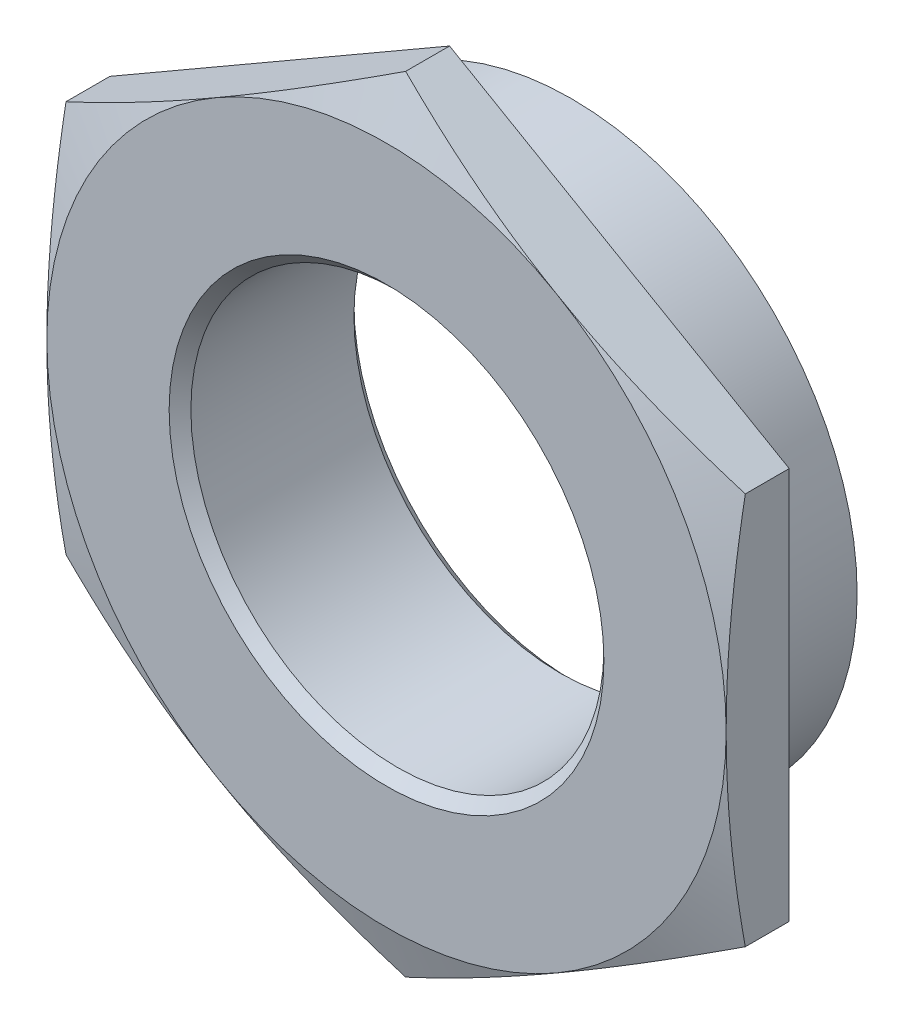
ISO-10303-21;
HEADER;
FILE_DESCRIPTION(('STEP AP214'),'2;1');
FILE_NAME('part.step','',(''),(''),'','','');
FILE_SCHEMA(('AUTOMOTIVE_DESIGN { 1 0 10303 214 1 1 1 1 }'));
ENDSEC;
DATA;
#1=APPLICATION_CONTEXT('core data for automotive mechanical design processes');
#2=APPLICATION_PROTOCOL_DEFINITION('international standard','automotive_design',2000,#1);
#3=PRODUCT_CONTEXT('',#1,'mechanical');
#4=PRODUCT('Part','Part','',(#3));
#5=PRODUCT_RELATED_PRODUCT_CATEGORY('part','',(#4));
#6=PRODUCT_DEFINITION_FORMATION('','',#4);
#7=PRODUCT_DEFINITION_CONTEXT('part definition',#1,'design');
#8=PRODUCT_DEFINITION('design','',#6,#7);
#9=PRODUCT_DEFINITION_SHAPE('','',#8);
#10=(LENGTH_UNIT() NAMED_UNIT(*) SI_UNIT(.MILLI.,.METRE.));
#11=(NAMED_UNIT(*) PLANE_ANGLE_UNIT() SI_UNIT($,.RADIAN.));
#12=(NAMED_UNIT(*) SI_UNIT($,.STERADIAN.) SOLID_ANGLE_UNIT());
#13=UNCERTAINTY_MEASURE_WITH_UNIT(LENGTH_MEASURE(1.E-05),#10,'distance_accuracy_value','');
#14=(GEOMETRIC_REPRESENTATION_CONTEXT(3) GLOBAL_UNCERTAINTY_ASSIGNED_CONTEXT((#13)) GLOBAL_UNIT_ASSIGNED_CONTEXT((#10,
#11,#12)) REPRESENTATION_CONTEXT('',''));
#15=CARTESIAN_POINT('',(0.,0.,0.));
#16=DIRECTION('',(0.,0.,1.));
#17=DIRECTION('',(1.,0.,0.));
#18=AXIS2_PLACEMENT_3D('',#15,#16,#17);
#19=CARTESIAN_POINT('',(3.96875,2.29135888084633,-2.159));
#20=DIRECTION('',(0.5,0.866025403784439,0.));
#21=DIRECTION('',(-0.866025403784439,0.5,0.));
#22=AXIS2_PLACEMENT_3D('',#19,#20,#21);
#23=PLANE('',#22);
#24=DIRECTION('',(0.,0.,1.));
#25=VECTOR('',#24,1.);
#26=CARTESIAN_POINT('',(0.,4.58271776169265,-2.159));
#27=LINE('',#26,#25);
#28=CARTESIAN_POINT('',(0.,4.58271776169265,-0.7366));
#29=VERTEX_POINT('',#28);
#30=CARTESIAN_POINT('',(0.,4.58271776169265,-0.223465990055169));
#31=VERTEX_POINT('',#30);
#32=EDGE_CURVE('E130',#29,#31,#27,.T.);
#33=ORIENTED_EDGE('',*,*,#32,.T.);
#34=CARTESIAN_POINT('',(-0.000200000000000889,4.58283323174649,-0.223508019306122));
#35=CARTESIAN_POINT('',(0.164171124478996,4.48793351878154,-0.188953386893572));
#36=CARTESIAN_POINT('',(0.329084297102321,4.39272085417455,-0.157519889082355));
#37=CARTESIAN_POINT('',(0.659982994631842,4.20167640208138,-0.102217415747108));
#38=CARTESIAN_POINT('',(0.825969255714269,4.10584418956367,-0.0783543603716573));
#39=CARTESIAN_POINT('',(1.15717193911945,3.91462423114336,-0.0397565169298386));
#40=CARTESIAN_POINT('',(1.32238079647206,3.81924085287832,-0.0249375356401638));
#41=CARTESIAN_POINT('',(1.65318488137888,3.62825102540834,-0.00506110758966477));
#42=CARTESIAN_POINT('',(1.81877994068944,3.53264467333892,0.));
#43=CARTESIAN_POINT('',(2.14997005931056,3.34143196920007,0.));
#44=CARTESIAN_POINT('',(2.31556511862112,3.24582561713064,-0.00506110758966457));
#45=CARTESIAN_POINT('',(2.64636920352794,3.05483578966066,-0.0249375356401636));
#46=CARTESIAN_POINT('',(2.81157806088055,2.95945241139562,-0.0397565169298384));
#47=CARTESIAN_POINT('',(3.14278074428573,2.76823245297532,-0.078354360371657));
#48=CARTESIAN_POINT('',(3.30876700536815,2.6724002404576,-0.102217415747107));
#49=CARTESIAN_POINT('',(3.63966570289768,2.48135578836443,-0.157519889082355));
#50=CARTESIAN_POINT('',(3.804578875521,2.38614312375744,-0.188953386893571));
#51=CARTESIAN_POINT('',(3.96895,2.29124341079249,-0.223508019306122));
#52=B_SPLINE_CURVE_WITH_KNOTS('',3,(#34,#35,#36,#37,#38,#39,#40,#41,#42,#43,#44,#45,#46,#47,#48,
#49,#50,#51),.UNSPECIFIED.,.F.,.F.,(4,2,2,2,2,2,2,2,4),(0.,0.578817519156193,1.15808656897075,
1.73187737871073,2.30545287935136,2.879028379992,3.45281918973198,4.03208823954654,
4.61090575870273),.UNSPECIFIED.);
#53=CARTESIAN_POINT('',(1.984375,3.43703832126949,0.));
#54=VERTEX_POINT('',#53);
#55=EDGE_CURVE('E61',#31,#54,#52,.T.);
#56=ORIENTED_EDGE('',*,*,#55,.T.);
#57=CARTESIAN_POINT('',(3.96875,2.29135888084633,-0.223465990055169));
#58=VERTEX_POINT('',#57);
#59=EDGE_CURVE('E108',#54,#58,#52,.T.);
#60=ORIENTED_EDGE('',*,*,#59,.T.);
#61=DIRECTION('',(0.,0.,1.));
#62=VECTOR('',#61,1.);
#63=CARTESIAN_POINT('',(3.96875,2.29135888084633,-2.159));
#64=LINE('',#63,#62);
#65=CARTESIAN_POINT('',(3.96875,2.29135888084633,-0.7366));
#66=VERTEX_POINT('',#65);
#67=EDGE_CURVE('E217',#66,#58,#64,.T.);
#68=ORIENTED_EDGE('',*,*,#67,.F.);
#69=DIRECTION('',(0.866025403784439,-0.5,0.));
#70=VECTOR('',#69,1.);
#71=CARTESIAN_POINT('',(3.96875,2.29135888084633,-0.7366));
#72=LINE('',#71,#70);
#73=EDGE_CURVE('E229',#29,#66,#72,.T.);
#74=ORIENTED_EDGE('',*,*,#73,.F.);
#75=EDGE_LOOP('',(#33,#56,#60,#68,#74));
#76=FACE_BOUND('',#75,.T.);
#77=ADVANCED_FACE('F37',(#76),#23,.T.);
#78=CARTESIAN_POINT('',(3.96875,-2.29135888084633,-2.159));
#79=DIRECTION('',(1.,0.,0.));
#80=DIRECTION('',(0.,1.,0.));
#81=AXIS2_PLACEMENT_3D('',#78,#79,#80);
#82=PLANE('',#81);
#83=ORIENTED_EDGE('',*,*,#67,.T.);
#84=CARTESIAN_POINT('',(3.96875,-6.11571747941205,-1.20905773002469));
#85=CARTESIAN_POINT('',(3.96875,-5.93560694210027,-1.15408226577977));
#86=CARTESIAN_POINT('',(3.96875,-5.7553003299482,-1.09973764457856));
#87=CARTESIAN_POINT('',(3.96875,-5.3941949938018,-0.99265901905197));
#88=CARTESIAN_POINT('',(3.96875,-5.21339623309016,-0.939925138695819));
#89=CARTESIAN_POINT('',(3.96875,-4.85090969844325,-0.83633271936481));
#90=CARTESIAN_POINT('',(3.96875,-4.66922091189536,-0.785477711144874));
#91=CARTESIAN_POINT('',(3.96875,-4.30517416670347,-0.686225484944989));
#92=CARTESIAN_POINT('',(3.96875,-4.12281621981197,-0.637828224018921));
#93=CARTESIAN_POINT('',(3.96875,-3.75955319947585,-0.544676401725705));
#94=CARTESIAN_POINT('',(3.96875,-3.57865776921711,-0.499884418257548));
#95=CARTESIAN_POINT('',(3.96875,-3.21598143545444,-0.414042678868963));
#96=CARTESIAN_POINT('',(3.96875,-3.03420056135954,-0.372992799539532));
#97=CARTESIAN_POINT('',(3.96875,-2.66968893890538,-0.295572325523377));
#98=CARTESIAN_POINT('',(3.96875,-2.48695846562532,-0.259200446620567));
#99=CARTESIAN_POINT('',(3.96875,-2.12043447101567,-0.192231102887664));
#100=CARTESIAN_POINT('',(3.96875,-1.93664098429678,-0.16163345113298));
#101=CARTESIAN_POINT('',(3.96875,-1.58856786823472,-0.110464072059641));
#102=CARTESIAN_POINT('',(3.96875,-1.4243976824194,-0.0891548112543641));
#103=CARTESIAN_POINT('',(3.96875,-1.09535768248127,-0.0529207014050567));
#104=CARTESIAN_POINT('',(3.96875,-0.930487929274615,-0.0379953075457442));
#105=CARTESIAN_POINT('',(3.96875,-0.600370610485894,-0.0152447943074484));
#106=CARTESIAN_POINT('',(3.96875,-0.43512340258056,-0.00741456835886472));
#107=CARTESIAN_POINT('',(3.96875,-0.104442010557871,0.000747429412386027));
#108=CARTESIAN_POINT('',(3.96875,0.0609921719480483,0.00107926537421316));
#109=CARTESIAN_POINT('',(3.96875,0.392556885344696,-0.00579169582896528));
#110=CARTESIAN_POINT('',(3.96875,0.558686595571475,-0.0130334478245484));
#111=CARTESIAN_POINT('',(3.96875,0.890471142111432,-0.0347204552699951));
#112=CARTESIAN_POINT('',(3.96875,1.05612596671929,-0.0491658867716981));
#113=CARTESIAN_POINT('',(3.96875,1.38687577329655,-0.0845743007464572));
#114=CARTESIAN_POINT('',(3.96875,1.55197012931405,-0.10554304561562));
#115=CARTESIAN_POINT('',(3.96875,1.88133239796501,-0.153132898911361));
#116=CARTESIAN_POINT('',(3.96875,2.04560030739566,-0.179754029225919));
#117=CARTESIAN_POINT('',(3.96875,2.3867940635803,-0.240157768471628));
#118=CARTESIAN_POINT('',(3.96875,2.56364678604448,-0.274349885700776));
#119=CARTESIAN_POINT('',(3.96875,2.91641463617557,-0.347298240655703));
#120=CARTESIAN_POINT('',(3.96875,3.0923296841202,-0.386054860190044));
#121=CARTESIAN_POINT('',(3.96875,3.44335289056624,-0.467265016425243));
#122=CARTESIAN_POINT('',(3.96875,3.61846079952144,-0.509719625019478));
#123=CARTESIAN_POINT('',(3.96875,3.96793001185936,-0.597607301830452));
#124=CARTESIAN_POINT('',(3.96875,4.14229128815387,-0.643040477151891));
#125=CARTESIAN_POINT('',(3.96875,4.66489047728162,-0.783043930086198));
#126=CARTESIAN_POINT('',(3.96875,5.01216499463144,-0.881203844915603));
#127=CARTESIAN_POINT('',(3.96875,5.70478701779749,-1.08379959604706));
#128=CARTESIAN_POINT('',(3.96874999999999,6.05013485099281,-1.18823432830457));
#129=CARTESIAN_POINT('',(3.96874999999999,6.73560553195841,-1.40022049685068));
#130=CARTESIAN_POINT('',(3.96874999999999,7.07574339741463,-1.50772353420053));
#131=CARTESIAN_POINT('',(3.96874999999999,7.75507399051602,-1.72572515333206));
#132=CARTESIAN_POINT('',(3.96874999999999,8.09426666712917,-1.83622389352782));
#133=CARTESIAN_POINT('',(3.96874999999999,8.77056405077001,-2.05894124214238));
#134=CARTESIAN_POINT('',(3.96874999999999,9.10767165256316,-2.17115108096458));
#135=CARTESIAN_POINT('',(3.96874999999999,9.78130609176436,-2.39720590735634));
#136=CARTESIAN_POINT('',(3.96874999999999,10.1178329770118,-2.51105075224825));
#137=CARTESIAN_POINT('',(3.96874999999999,10.454163831933,-2.62546352850404));
#138=B_SPLINE_CURVE_WITH_KNOTS('',3,(#84,#85,#86,#87,#88,#89,#90,#91,#92,#93,#94,#95,#96,#97,
#98,#99,#100,#101,#102,#103,#104,#105,#106,#107,#108,#109,#110,#111,#112,#113,#114,#115,#116,
#117,#118,#119,#120,#121,#122,#123,#124,#125,#126,#127,#128,#129,#130,#131,#132,#133,#134,#135,
#136,#137),.UNSPECIFIED.,.F.,.F.,(4,2,2,2,2,2,2,2,2,2,2,2,2,2,2,2,2,2,2,2,2,2,2,2,2,2,4),(0.,
0.56494544827728,1.12993426806961,1.69593576698342,2.26192737230977,2.820971372696,
3.37999692997149,3.93886869312937,4.49772236125909,4.99425676552057,5.49074878582625,
5.98688318393511,6.48301333824554,6.98170795284575,7.48041475571822,7.97956335025277,
8.47871387769757,9.01902204899537,9.55937544778716,10.0998859971276,10.6404159930717,
11.7229520219686,12.8052981349312,13.8754444016963,14.9456473690742,16.011519422179,
17.0772990211503),.UNSPECIFIED.);
#139=CARTESIAN_POINT('',(3.96875,0.,0.));
#140=VERTEX_POINT('',#139);
#141=EDGE_CURVE('E111',#58,#140,#138,.F.);
#142=ORIENTED_EDGE('',*,*,#141,.T.);
#143=CARTESIAN_POINT('',(3.96875,-2.29135888084633,-0.223465990055169));
#144=VERTEX_POINT('',#143);
#145=EDGE_CURVE('E140',#140,#144,#138,.F.);
#146=ORIENTED_EDGE('',*,*,#145,.T.);
#147=DIRECTION('',(0.,0.,1.));
#148=VECTOR('',#147,1.);
#149=CARTESIAN_POINT('',(3.96875,-2.29135888084633,-2.159));
#150=LINE('',#149,#148);
#151=CARTESIAN_POINT('',(3.96875,-2.29135888084633,-0.7366));
#152=VERTEX_POINT('',#151);
#153=EDGE_CURVE('E222',#152,#144,#150,.T.);
#154=ORIENTED_EDGE('',*,*,#153,.F.);
#155=DIRECTION('',(0.,-1.,0.));
#156=VECTOR('',#155,1.);
#157=CARTESIAN_POINT('',(3.96875,-2.29135888084633,-0.7366));
#158=LINE('',#157,#156);
#159=EDGE_CURVE('E220',#66,#152,#158,.T.);
#160=ORIENTED_EDGE('',*,*,#159,.F.);
#161=EDGE_LOOP('',(#83,#142,#146,#154,#160));
#162=FACE_BOUND('',#161,.T.);
#163=ADVANCED_FACE('F188',(#162),#82,.T.);
#164=CARTESIAN_POINT('',(0.,-4.58271776169265,-2.159));
#165=DIRECTION('',(0.5,-0.866025403784439,0.));
#166=DIRECTION('',(0.866025403784439,0.5,0.));
#167=AXIS2_PLACEMENT_3D('',#164,#165,#166);
#168=PLANE('',#167);
#169=ORIENTED_EDGE('',*,*,#153,.T.);
#170=CARTESIAN_POINT('',(3.96895,-2.29124341079249,-0.223508019306122));
#171=CARTESIAN_POINT('',(3.804578875521,-2.38614312375744,-0.188953386893572));
#172=CARTESIAN_POINT('',(3.63966570289768,-2.48135578836443,-0.157519889082355));
#173=CARTESIAN_POINT('',(3.30876700536816,-2.6724002404576,-0.102217415747108));
#174=CARTESIAN_POINT('',(3.14278074428573,-2.76823245297532,-0.0783543603716575));
#175=CARTESIAN_POINT('',(2.81157806088055,-2.95945241139562,-0.0397565169298387));
#176=CARTESIAN_POINT('',(2.64636920352794,-3.05483578966066,-0.0249375356401637));
#177=CARTESIAN_POINT('',(2.31556511862112,-3.24582561713064,-0.00506110758966481));
#178=CARTESIAN_POINT('',(2.14997005931056,-3.34143196920007,0.));
#179=CARTESIAN_POINT('',(1.81877994068944,-3.53264467333892,0.));
#180=CARTESIAN_POINT('',(1.65318488137888,-3.62825102540834,-0.00506110758966487));
#181=CARTESIAN_POINT('',(1.32238079647206,-3.81924085287832,-0.0249375356401637));
#182=CARTESIAN_POINT('',(1.15717193911945,-3.91462423114336,-0.0397565169298384));
#183=CARTESIAN_POINT('',(0.825969255714271,-4.10584418956367,-0.0783543603716572));
#184=CARTESIAN_POINT('',(0.659982994631844,-4.20167640208138,-0.102217415747108));
#185=CARTESIAN_POINT('',(0.329084297102322,-4.39272085417455,-0.157519889082355));
#186=CARTESIAN_POINT('',(0.164171124478998,-4.48793351878154,-0.188953386893572));
#187=CARTESIAN_POINT('',(-0.000199999999998635,-4.58283323174649,-0.223508019306122));
#188=B_SPLINE_CURVE_WITH_KNOTS('',3,(#170,#171,#172,#173,#174,#175,#176,#177,#178,#179,#180,
#181,#182,#183,#184,#185,#186,#187),.UNSPECIFIED.,.F.,.F.,(4,2,2,2,2,2,2,2,4),(0.,
0.578817519156193,1.15808656897075,1.73187737871073,2.30545287935136,2.879028379992,
3.45281918973198,4.03208823954654,4.61090575870273),.UNSPECIFIED.);
#189=CARTESIAN_POINT('',(1.984375,-3.43703832126949,0.));
#190=VERTEX_POINT('',#189);
#191=EDGE_CURVE('E182',#144,#190,#188,.T.);
#192=ORIENTED_EDGE('',*,*,#191,.T.);
#193=CARTESIAN_POINT('',(0.,-4.58271776169265,-0.223465990055169));
#194=VERTEX_POINT('',#193);
#195=EDGE_CURVE('E176',#190,#194,#188,.T.);
#196=ORIENTED_EDGE('',*,*,#195,.T.);
#197=DIRECTION('',(0.,0.,1.));
#198=VECTOR('',#197,1.);
#199=CARTESIAN_POINT('',(0.,-4.58271776169265,-2.159));
#200=LINE('',#199,#198);
#201=CARTESIAN_POINT('',(0.,-4.58271776169265,-0.7366));
#202=VERTEX_POINT('',#201);
#203=EDGE_CURVE('E226',#202,#194,#200,.T.);
#204=ORIENTED_EDGE('',*,*,#203,.F.);
#205=DIRECTION('',(-0.866025403784439,-0.5,0.));
#206=VECTOR('',#205,1.);
#207=CARTESIAN_POINT('',(0.,-4.58271776169265,-0.7366));
#208=LINE('',#207,#206);
#209=EDGE_CURVE('E260',#152,#202,#208,.T.);
#210=ORIENTED_EDGE('',*,*,#209,.F.);
#211=EDGE_LOOP('',(#169,#192,#196,#204,#210));
#212=FACE_BOUND('',#211,.T.);
#213=ADVANCED_FACE('F184',(#212),#168,.T.);
#214=CARTESIAN_POINT('',(-3.96875,-2.29135888084633,-2.159));
#215=DIRECTION('',(-0.5,-0.866025403784439,0.));
#216=DIRECTION('',(0.866025403784439,-0.5,0.));
#217=AXIS2_PLACEMENT_3D('',#214,#215,#216);
#218=PLANE('',#217);
#219=ORIENTED_EDGE('',*,*,#203,.T.);
#220=CARTESIAN_POINT('',(0.000200000000000944,-4.58283323174649,-0.223508019306122));
#221=CARTESIAN_POINT('',(-0.164171124478996,-4.48793351878154,-0.188953386893571));
#222=CARTESIAN_POINT('',(-0.329084297102321,-4.39272085417455,-0.157519889082355));
#223=CARTESIAN_POINT('',(-0.659982994631842,-4.20167640208138,-0.102217415747107));
#224=CARTESIAN_POINT('',(-0.825969255714269,-4.10584418956367,-0.078354360371657));
#225=CARTESIAN_POINT('',(-1.15717193911945,-3.91462423114336,-0.0397565169298382));
#226=CARTESIAN_POINT('',(-1.32238079647206,-3.81924085287832,-0.0249375356401632));
#227=CARTESIAN_POINT('',(-1.65318488137888,-3.62825102540834,-0.00506110758966421));
#228=CARTESIAN_POINT('',(-1.81877994068944,-3.53264467333891,0.));
#229=CARTESIAN_POINT('',(-2.14997005931056,-3.34143196920007,0.));
#230=CARTESIAN_POINT('',(-2.31556511862112,-3.24582561713064,-0.00506110758966442));
#231=CARTESIAN_POINT('',(-2.64636920352794,-3.05483578966066,-0.0249375356401634));
#232=CARTESIAN_POINT('',(-2.81157806088055,-2.95945241139562,-0.0397565169298383));
#233=CARTESIAN_POINT('',(-3.14278074428573,-2.76823245297532,-0.0783543603716571));
#234=CARTESIAN_POINT('',(-3.30876700536816,-2.6724002404576,-0.102217415747108));
#235=CARTESIAN_POINT('',(-3.63966570289768,-2.48135578836443,-0.157519889082355));
#236=CARTESIAN_POINT('',(-3.804578875521,-2.38614312375744,-0.188953386893572));
#237=CARTESIAN_POINT('',(-3.96895,-2.29124341079249,-0.223508019306122));
#238=B_SPLINE_CURVE_WITH_KNOTS('',3,(#220,#221,#222,#223,#224,#225,#226,#227,#228,#229,#230,
#231,#232,#233,#234,#235,#236,#237),.UNSPECIFIED.,.F.,.F.,(4,2,2,2,2,2,2,2,4),(0.,
0.578817519156193,1.15808656897075,1.73187737871073,2.30545287935137,2.879028379992,
3.45281918973198,4.03208823954654,4.61090575870273),.UNSPECIFIED.);
#239=CARTESIAN_POINT('',(-1.984375,-3.43703832126949,0.));
#240=VERTEX_POINT('',#239);
#241=EDGE_CURVE('E183',#194,#240,#238,.T.);
#242=ORIENTED_EDGE('',*,*,#241,.T.);
#243=CARTESIAN_POINT('',(-3.96875,-2.29135888084634,-0.223465990055154));
#244=VERTEX_POINT('',#243);
#245=EDGE_CURVE('E171',#240,#244,#238,.T.);
#246=ORIENTED_EDGE('',*,*,#245,.T.);
#247=DIRECTION('',(0.,0.,1.));
#248=VECTOR('',#247,1.);
#249=CARTESIAN_POINT('',(-3.96875,-2.29135888084633,-2.159));
#250=LINE('',#249,#248);
#251=CARTESIAN_POINT('',(-3.96875,-2.29135888084633,-0.7366));
#252=VERTEX_POINT('',#251);
#253=EDGE_CURVE('E234',#252,#244,#250,.T.);
#254=ORIENTED_EDGE('',*,*,#253,.F.);
#255=DIRECTION('',(-0.866025403784439,0.5,0.));
#256=VECTOR('',#255,1.);
#257=CARTESIAN_POINT('',(-3.96875,-2.29135888084633,-0.7366));
#258=LINE('',#257,#256);
#259=EDGE_CURVE('E258',#202,#252,#258,.T.);
#260=ORIENTED_EDGE('',*,*,#259,.F.);
#261=EDGE_LOOP('',(#219,#242,#246,#254,#260));
#262=FACE_BOUND('',#261,.T.);
#263=ADVANCED_FACE('F187',(#262),#218,.T.);
#264=CARTESIAN_POINT('',(-3.96875,2.29135888084633,-2.159));
#265=DIRECTION('',(-1.,0.,0.));
#266=DIRECTION('',(0.,0.,1.));
#267=AXIS2_PLACEMENT_3D('',#264,#265,#266);
#268=PLANE('',#267);
#269=ORIENTED_EDGE('',*,*,#253,.T.);
#270=CARTESIAN_POINT('',(-3.96875,-6.11571747936954,-1.20905773001172));
#271=CARTESIAN_POINT('',(-3.96875,-5.9356069420594,-1.15408226576741));
#272=CARTESIAN_POINT('',(-3.96875,-5.75530032990899,-1.09973764456681));
#273=CARTESIAN_POINT('',(-3.96875,-5.39419499376589,-0.992659019041444));
#274=CARTESIAN_POINT('',(-3.96875,-5.2133962330559,-0.939925138685899));
#275=CARTESIAN_POINT('',(-3.96875,-4.85090969841231,-0.836332719356096));
#276=CARTESIAN_POINT('',(-3.96875,-4.66922091186609,-0.785477711136759));
#277=CARTESIAN_POINT('',(-3.96875,-4.30517416667754,-0.686225484938053));
#278=CARTESIAN_POINT('',(-3.96875,-4.12281621978771,-0.637828224012565));
#279=CARTESIAN_POINT('',(-3.96875,-3.75955319945493,-0.544676401720474));
#280=CARTESIAN_POINT('',(-3.96875,-3.57865776919785,-0.499884418252862));
#281=CARTESIAN_POINT('',(-3.96875,-3.21598143543852,-0.414042678865324));
#282=CARTESIAN_POINT('',(-3.96875,-3.0342005613453,-0.372992799536395));
#283=CARTESIAN_POINT('',(-3.96875,-2.66968893889451,-0.295572325521179));
#284=CARTESIAN_POINT('',(-3.96875,-2.48695846561613,-0.259200446618807));
#285=CARTESIAN_POINT('',(-3.96875,-2.12043447100988,-0.192231102886688));
#286=CARTESIAN_POINT('',(-3.96875,-1.9366409842927,-0.16163345113235));
#287=CARTESIAN_POINT('',(-3.96875,-1.58856786823193,-0.110464072059259));
#288=CARTESIAN_POINT('',(-3.96875,-1.42439768241618,-0.089154811253962));
#289=CARTESIAN_POINT('',(-3.96875,-1.09535768247719,-0.0529207014046555));
#290=CARTESIAN_POINT('',(-3.96875,-0.930487929270101,-0.037995307545363));
#291=CARTESIAN_POINT('',(-3.96875,-0.600370610480518,-0.0152447943071494));
#292=CARTESIAN_POINT('',(-3.96875,-0.435123402574751,-0.007414568358628));
#293=CARTESIAN_POINT('',(-3.96875,-0.104442010551204,0.000747429412456227));
#294=CARTESIAN_POINT('',(-3.96875,0.0609921719551436,0.00107926537417915));
#295=CARTESIAN_POINT('',(-3.96875,0.392556885352658,-0.00579169582924482));
#296=CARTESIAN_POINT('',(-3.96875,0.558686595579875,-0.0130334478249701));
#297=CARTESIAN_POINT('',(-3.96875,0.890471142120703,-0.0347204552707297));
#298=CARTESIAN_POINT('',(-3.96875,1.05612596672899,-0.0491658867726033));
#299=CARTESIAN_POINT('',(-3.96875,1.38687577330711,-0.0845743007477227));
#300=CARTESIAN_POINT('',(-3.96875,1.55197012932504,-0.105543045617075));
#301=CARTESIAN_POINT('',(-3.96875,1.88133239797685,-0.153132898913205));
#302=CARTESIAN_POINT('',(-3.96875,2.04560030740791,-0.179754029227962));
#303=CARTESIAN_POINT('',(-3.96875,2.38679406359297,-0.24015776847401));
#304=CARTESIAN_POINT('',(-3.96875,2.56364678605715,-0.274349885703283));
#305=CARTESIAN_POINT('',(-3.96875,2.91641463618825,-0.34729824065844));
#306=CARTESIAN_POINT('',(-3.96875,3.09232968413289,-0.386054860192887));
#307=CARTESIAN_POINT('',(-3.96875,3.44335289057893,-0.467265016428276));
#308=CARTESIAN_POINT('',(-3.96875,3.61846079953414,-0.509719625022597));
#309=CARTESIAN_POINT('',(-3.96875,3.96793001187207,-0.597607301833728));
#310=CARTESIAN_POINT('',(-3.96875,4.14229128816659,-0.643040477155239));
#311=CARTESIAN_POINT('',(-3.96875,4.66489047729437,-0.78304393008974));
#312=CARTESIAN_POINT('',(-3.96875,5.0121649946442,-0.881203844919251));
#313=CARTESIAN_POINT('',(-3.96875,5.70478701781028,-1.08379959605089));
#314=CARTESIAN_POINT('',(-3.96875,6.05013485100563,-1.18823432830847));
#315=CARTESIAN_POINT('',(-3.96875,6.73560553197114,-1.40022049685468));
#316=CARTESIAN_POINT('',(-3.96875,7.07574339742724,-1.50772353420454));
#317=CARTESIAN_POINT('',(-3.96875,7.75507399052841,-1.72572515333607));
#318=CARTESIAN_POINT('',(-3.96875,8.09426666714144,-1.83622389353183));
#319=CARTESIAN_POINT('',(-3.96875,8.77056405078208,-2.05894124214639));
#320=CARTESIAN_POINT('',(-3.96875,9.10767165257515,-2.17115108096858));
#321=CARTESIAN_POINT('',(-3.96875,9.78130609177617,-2.39720590736032));
#322=CARTESIAN_POINT('',(-3.96875,10.1178329770235,-2.51105075225222));
#323=CARTESIAN_POINT('',(-3.96875,10.4541638319447,-2.625463528508));
#324=B_SPLINE_CURVE_WITH_KNOTS('',3,(#270,#271,#272,#273,#274,#275,#276,#277,#278,#279,#280,
#281,#282,#283,#284,#285,#286,#287,#288,#289,#290,#291,#292,#293,#294,#295,#296,#297,#298,#299,
#300,#301,#302,#303,#304,#305,#306,#307,#308,#309,#310,#311,#312,#313,#314,#315,#316,#317,#318,
#319,#320,#321,#322,#323),.UNSPECIFIED.,.F.,.F.,(4,2,2,2,2,2,2,2,2,2,2,2,2,2,2,2,2,2,2,2,2,2,2,
2,2,2,4),(0.,0.564945448272012,1.12993426805907,1.69593576696759,2.26192737228864,
2.82097137266963,3.37999692993988,3.93886869309253,4.49772236121703,4.9942567654798,
5.49074878578677,5.98688318389691,6.48301333820862,6.98170795281016,7.48041475568396,
7.97956335021986,8.47871387766599,9.01902204896387,9.55937544775574,10.0998859970962,
10.6404159930405,11.7229520219375,12.8052981349002,13.875444401665,14.9456473690426,
16.0115194221471,17.0772990211181),.UNSPECIFIED.);
#325=CARTESIAN_POINT('',(-3.96875,0.,0.));
#326=VERTEX_POINT('',#325);
#327=EDGE_CURVE('E269',#244,#326,#324,.T.);
#328=ORIENTED_EDGE('',*,*,#327,.T.);
#329=CARTESIAN_POINT('',(-3.96875,2.29135888084633,-0.22346599005517));
#330=VERTEX_POINT('',#329);
#331=EDGE_CURVE('E165',#326,#330,#324,.T.);
#332=ORIENTED_EDGE('',*,*,#331,.T.);
#333=DIRECTION('',(0.,0.,1.));
#334=VECTOR('',#333,1.);
#335=CARTESIAN_POINT('',(-3.96875,2.29135888084633,-2.159));
#336=LINE('',#335,#334);
#337=CARTESIAN_POINT('',(-3.96875,2.29135888084633,-0.7366));
#338=VERTEX_POINT('',#337);
#339=EDGE_CURVE('E237',#338,#330,#336,.T.);
#340=ORIENTED_EDGE('',*,*,#339,.F.);
#341=DIRECTION('',(0.,1.,0.));
#342=VECTOR('',#341,1.);
#343=CARTESIAN_POINT('',(-3.96875,2.29135888084633,-0.7366));
#344=LINE('',#343,#342);
#345=EDGE_CURVE('E256',#252,#338,#344,.T.);
#346=ORIENTED_EDGE('',*,*,#345,.F.);
#347=EDGE_LOOP('',(#269,#328,#332,#340,#346));
#348=FACE_BOUND('',#347,.T.);
#349=ADVANCED_FACE('F194',(#348),#268,.T.);
#350=CARTESIAN_POINT('',(0.,4.58271776169265,-2.159));
#351=DIRECTION('',(-0.5,0.866025403784439,0.));
#352=DIRECTION('',(-0.866025403784439,-0.5,0.));
#353=AXIS2_PLACEMENT_3D('',#350,#351,#352);
#354=PLANE('',#353);
#355=ORIENTED_EDGE('',*,*,#339,.T.);
#356=CARTESIAN_POINT('',(-3.96895,2.29124341079249,-0.223508019306122));
#357=CARTESIAN_POINT('',(-3.804578875521,2.38614312375744,-0.188953386893572));
#358=CARTESIAN_POINT('',(-3.63966570289768,2.48135578836443,-0.157519889082356));
#359=CARTESIAN_POINT('',(-3.30876700536816,2.6724002404576,-0.102217415747108));
#360=CARTESIAN_POINT('',(-3.14278074428573,2.76823245297532,-0.0783543603716575));
#361=CARTESIAN_POINT('',(-2.81157806088055,2.95945241139562,-0.0397565169298387));
#362=CARTESIAN_POINT('',(-2.64636920352794,3.05483578966066,-0.0249375356401639));
#363=CARTESIAN_POINT('',(-2.31556511862112,3.24582561713064,-0.00506110758966495));
#364=CARTESIAN_POINT('',(-2.14997005931056,3.34143196920007,0.));
#365=CARTESIAN_POINT('',(-1.81877994068944,3.53264467333892,0.));
#366=CARTESIAN_POINT('',(-1.65318488137888,3.62825102540834,-0.00506110758966489));
#367=CARTESIAN_POINT('',(-1.32238079647206,3.81924085287832,-0.0249375356401638));
#368=CARTESIAN_POINT('',(-1.15717193911945,3.91462423114336,-0.0397565169298386));
#369=CARTESIAN_POINT('',(-0.82596925571427,4.10584418956367,-0.0783543603716574));
#370=CARTESIAN_POINT('',(-0.659982994631844,4.20167640208138,-0.102217415747108));
#371=CARTESIAN_POINT('',(-0.329084297102322,4.39272085417455,-0.157519889082356));
#372=CARTESIAN_POINT('',(-0.164171124478998,4.48793351878154,-0.188953386893572));
#373=CARTESIAN_POINT('',(0.000199999999998907,4.58283323174649,-0.223508019306122));
#374=B_SPLINE_CURVE_WITH_KNOTS('',3,(#356,#357,#358,#359,#360,#361,#362,#363,#364,#365,#366,
#367,#368,#369,#370,#371,#372,#373),.UNSPECIFIED.,.F.,.F.,(4,2,2,2,2,2,2,2,4),(0.,
0.578817519156193,1.15808656897075,1.73187737871073,2.30545287935137,2.879028379992,
3.45281918973198,4.03208823954654,4.61090575870273),.UNSPECIFIED.);
#375=CARTESIAN_POINT('',(-1.984375,3.43703832126949,0.));
#376=VERTEX_POINT('',#375);
#377=EDGE_CURVE('E267',#330,#376,#374,.T.);
#378=ORIENTED_EDGE('',*,*,#377,.T.);
#379=EDGE_CURVE('E117',#376,#31,#374,.T.);
#380=ORIENTED_EDGE('',*,*,#379,.T.);
#381=ORIENTED_EDGE('',*,*,#32,.F.);
#382=DIRECTION('',(0.866025403784439,0.5,0.));
#383=VECTOR('',#382,1.);
#384=CARTESIAN_POINT('',(0.,4.58271776169265,-0.7366));
#385=LINE('',#384,#383);
#386=EDGE_CURVE('E221',#338,#29,#385,.T.);
#387=ORIENTED_EDGE('',*,*,#386,.F.);
#388=EDGE_LOOP('',(#355,#378,#380,#381,#387));
#389=FACE_BOUND('',#388,.T.);
#390=ADVANCED_FACE('F198',(#389),#354,.T.);
#391=CARTESIAN_POINT('',(-3.96875,6.87407664253898,0.));
#392=DIRECTION('',(0.,0.,1.));
#393=DIRECTION('',(1.,0.,0.));
#394=AXIS2_PLACEMENT_3D('',#391,#392,#393);
#395=PLANE('',#394);
#396=CARTESIAN_POINT('',(0.,0.,0.));
#397=DIRECTION('',(0.,0.,1.));
#398=DIRECTION('',(1.,0.,0.));
#399=AXIS2_PLACEMENT_3D('',#396,#397,#398);
#400=CIRCLE('',#399,2.54);
#401=CARTESIAN_POINT('',(2.54,0.,0.));
#402=VERTEX_POINT('',#401);
#403=EDGE_CURVE('E243',#402,#402,#400,.T.);
#404=ORIENTED_EDGE('',*,*,#403,.F.);
#405=EDGE_LOOP('',(#404));
#406=FACE_BOUND('',#405,.T.);
#407=CARTESIAN_POINT('',(0.,0.,0.));
#408=DIRECTION('',(0.,0.,1.));
#409=DIRECTION('',(1.,0.,0.));
#410=AXIS2_PLACEMENT_3D('',#407,#408,#409);
#411=CIRCLE('',#410,3.96875);
#412=EDGE_CURVE('E41',#190,#140,#411,.T.);
#413=ORIENTED_EDGE('',*,*,#412,.T.);
#414=CARTESIAN_POINT('',(0.,0.,0.));
#415=DIRECTION('',(0.,0.,1.));
#416=DIRECTION('',(1.,0.,0.));
#417=AXIS2_PLACEMENT_3D('',#414,#415,#416);
#418=CIRCLE('',#417,3.96875);
#419=EDGE_CURVE('E53',#140,#54,#418,.T.);
#420=ORIENTED_EDGE('',*,*,#419,.T.);
#421=EDGE_CURVE('E13',#54,#376,#411,.T.);
#422=ORIENTED_EDGE('',*,*,#421,.T.);
#423=EDGE_CURVE('E46',#376,#326,#411,.T.);
#424=ORIENTED_EDGE('',*,*,#423,.T.);
#425=EDGE_CURVE('E285',#326,#240,#411,.T.);
#426=ORIENTED_EDGE('',*,*,#425,.T.);
#427=EDGE_CURVE('E279',#240,#190,#411,.T.);
#428=ORIENTED_EDGE('',*,*,#427,.T.);
#429=EDGE_LOOP('',(#413,#420,#422,#424,#426,#428));
#430=FACE_BOUND('',#429,.T.);
#431=ADVANCED_FACE('F123',(#406,#430),#395,.T.);
#432=CARTESIAN_POINT('',(0.,0.,12.2657939689207));
#433=DIRECTION('',(0.,0.,-1.));
#434=DIRECTION('',(-1.,0.,0.));
#435=AXIS2_PLACEMENT_3D('',#432,#433,#434);
#436=CYLINDRICAL_SURFACE('',#435,3.3401);
#437=CARTESIAN_POINT('',(0.,0.,-2.159));
#438=DIRECTION('',(0.,0.,-1.));
#439=DIRECTION('',(-1.,0.,0.));
#440=AXIS2_PLACEMENT_3D('',#437,#438,#439);
#441=CIRCLE('',#440,3.3401);
#442=CARTESIAN_POINT('',(-3.3401,0.,-2.159));
#443=VERTEX_POINT('',#442);
#444=EDGE_CURVE('E242',#443,#443,#441,.T.);
#445=ORIENTED_EDGE('',*,*,#444,.F.);
#446=EDGE_LOOP('',(#445));
#447=FACE_BOUND('',#446,.T.);
#448=CARTESIAN_POINT('',(0.,0.,-0.7366));
#449=DIRECTION('',(0.,0.,1.));
#450=DIRECTION('',(1.,0.,0.));
#451=AXIS2_PLACEMENT_3D('',#448,#449,#450);
#452=CIRCLE('',#451,3.3401);
#453=CARTESIAN_POINT('',(3.3401,0.,-0.7366));
#454=VERTEX_POINT('',#453);
#455=EDGE_CURVE('E253',#454,#454,#452,.F.);
#456=ORIENTED_EDGE('',*,*,#455,.T.);
#457=EDGE_LOOP('',(#456));
#458=FACE_BOUND('',#457,.T.);
#459=ADVANCED_FACE('F206',(#447,#458),#436,.T.);
#460=CARTESIAN_POINT('',(-3.96875,6.87407664253898,-0.7366));
#461=DIRECTION('',(0.,0.,1.));
#462=DIRECTION('',(1.,0.,0.));
#463=AXIS2_PLACEMENT_3D('',#460,#461,#462);
#464=PLANE('',#463);
#465=ORIENTED_EDGE('',*,*,#73,.T.);
#466=ORIENTED_EDGE('',*,*,#159,.T.);
#467=ORIENTED_EDGE('',*,*,#209,.T.);
#468=ORIENTED_EDGE('',*,*,#259,.T.);
#469=ORIENTED_EDGE('',*,*,#345,.T.);
#470=ORIENTED_EDGE('',*,*,#386,.T.);
#471=EDGE_LOOP('',(#465,#466,#467,#468,#469,#470));
#472=FACE_BOUND('',#471,.T.);
#473=ORIENTED_EDGE('',*,*,#455,.F.);
#474=EDGE_LOOP('',(#473));
#475=FACE_BOUND('',#474,.T.);
#476=ADVANCED_FACE('F263',(#472,#475),#464,.F.);
#477=CARTESIAN_POINT('',(-3.96875,6.87407664253898,-2.159));
#478=DIRECTION('',(0.,0.,1.));
#479=DIRECTION('',(1.,0.,0.));
#480=AXIS2_PLACEMENT_3D('',#477,#478,#479);
#481=PLANE('',#480);
#482=CARTESIAN_POINT('',(0.,0.,-2.159));
#483=DIRECTION('',(0.,0.,-1.));
#484=DIRECTION('',(-1.,0.,0.));
#485=AXIS2_PLACEMENT_3D('',#482,#483,#484);
#486=CIRCLE('',#485,2.54);
#487=CARTESIAN_POINT('',(-2.54,0.,-2.159));
#488=VERTEX_POINT('',#487);
#489=EDGE_CURVE('E131',#488,#488,#486,.T.);
#490=ORIENTED_EDGE('',*,*,#489,.F.);
#491=EDGE_LOOP('',(#490));
#492=FACE_BOUND('',#491,.T.);
#493=ORIENTED_EDGE('',*,*,#444,.T.);
#494=EDGE_LOOP('',(#493));
#495=FACE_BOUND('',#494,.T.);
#496=ADVANCED_FACE('F376',(#492,#495),#481,.F.);
#497=CARTESIAN_POINT('',(0.,0.,-2.159));
#498=DIRECTION('',(0.,0.,1.));
#499=DIRECTION('',(1.,0.,0.));
#500=AXIS2_PLACEMENT_3D('',#497,#498,#499);
#501=CYLINDRICAL_SURFACE('',#500,2.413);
#502=CARTESIAN_POINT('',(0.,0.,-2.032));
#503=DIRECTION('',(0.,0.,-1.));
#504=DIRECTION('',(-1.,0.,0.));
#505=AXIS2_PLACEMENT_3D('',#502,#503,#504);
#506=CIRCLE('',#505,2.413);
#507=CARTESIAN_POINT('',(-2.413,0.,-2.032));
#508=VERTEX_POINT('',#507);
#509=EDGE_CURVE('E133',#508,#508,#506,.T.);
#510=ORIENTED_EDGE('',*,*,#509,.T.);
#511=EDGE_LOOP('',(#510));
#512=FACE_BOUND('',#511,.T.);
#513=CARTESIAN_POINT('',(0.,0.,-0.127));
#514=DIRECTION('',(0.,0.,1.));
#515=DIRECTION('',(1.,0.,0.));
#516=AXIS2_PLACEMENT_3D('',#513,#514,#515);
#517=CIRCLE('',#516,2.413);
#518=CARTESIAN_POINT('',(2.413,0.,-0.127));
#519=VERTEX_POINT('',#518);
#520=EDGE_CURVE('E240',#519,#519,#517,.T.);
#521=ORIENTED_EDGE('',*,*,#520,.T.);
#522=EDGE_LOOP('',(#521));
#523=FACE_BOUND('',#522,.T.);
#524=ADVANCED_FACE('F371',(#512,#523),#501,.F.);
#525=CARTESIAN_POINT('',(0.,0.,0.));
#526=DIRECTION('',(0.,0.,1.));
#527=DIRECTION('',(1.,0.,0.));
#528=AXIS2_PLACEMENT_3D('',#525,#526,#527);
#529=CONICAL_SURFACE('',#528,2.54,0.78539816339745);
#530=ORIENTED_EDGE('',*,*,#403,.T.);
#531=EDGE_LOOP('',(#530));
#532=FACE_BOUND('',#531,.T.);
#533=ORIENTED_EDGE('',*,*,#520,.F.);
#534=EDGE_LOOP('',(#533));
#535=FACE_BOUND('',#534,.T.);
#536=ADVANCED_FACE('F297',(#532,#535),#529,.F.);
#537=CARTESIAN_POINT('',(0.,0.,-2.159));
#538=DIRECTION('',(0.,0.,-1.));
#539=DIRECTION('',(-1.,0.,0.));
#540=AXIS2_PLACEMENT_3D('',#537,#538,#539);
#541=CONICAL_SURFACE('',#540,2.54,0.78539816339745);
#542=ORIENTED_EDGE('',*,*,#489,.T.);
#543=EDGE_LOOP('',(#542));
#544=FACE_BOUND('',#543,.T.);
#545=ORIENTED_EDGE('',*,*,#509,.F.);
#546=EDGE_LOOP('',(#545));
#547=FACE_BOUND('',#546,.T.);
#548=ADVANCED_FACE('F153',(#544,#547),#541,.F.);
#549=CARTESIAN_POINT('',(0.,0.,0.));
#550=DIRECTION('',(0.,0.,-1.));
#551=DIRECTION('',(1.,0.,0.));
#552=AXIS2_PLACEMENT_3D('',#549,#550,#551);
#553=CONICAL_SURFACE('',#552,3.96875,1.22173047639603);
#554=ORIENTED_EDGE('',*,*,#412,.F.);
#555=ORIENTED_EDGE('',*,*,#191,.F.);
#556=ORIENTED_EDGE('',*,*,#145,.F.);
#557=EDGE_LOOP('',(#554,#555,#556));
#558=FACE_BOUND('',#557,.T.);
#559=ADVANCED_FACE('F283',(#558),#553,.T.);
#560=ORIENTED_EDGE('',*,*,#427,.F.);
#561=ORIENTED_EDGE('',*,*,#241,.F.);
#562=ORIENTED_EDGE('',*,*,#195,.F.);
#563=EDGE_LOOP('',(#560,#561,#562));
#564=FACE_BOUND('',#563,.T.);
#565=ADVANCED_FACE('F278',(#564),#553,.T.);
#566=ORIENTED_EDGE('',*,*,#425,.F.);
#567=ORIENTED_EDGE('',*,*,#327,.F.);
#568=ORIENTED_EDGE('',*,*,#245,.F.);
#569=EDGE_LOOP('',(#566,#567,#568));
#570=FACE_BOUND('',#569,.T.);
#571=ADVANCED_FACE('F151',(#570),#553,.T.);
#572=ORIENTED_EDGE('',*,*,#423,.F.);
#573=ORIENTED_EDGE('',*,*,#377,.F.);
#574=ORIENTED_EDGE('',*,*,#331,.F.);
#575=EDGE_LOOP('',(#572,#573,#574));
#576=FACE_BOUND('',#575,.T.);
#577=ADVANCED_FACE('F147',(#576),#553,.T.);
#578=ORIENTED_EDGE('',*,*,#379,.F.);
#579=ORIENTED_EDGE('',*,*,#421,.F.);
#580=ORIENTED_EDGE('',*,*,#55,.F.);
#581=EDGE_LOOP('',(#578,#579,#580));
#582=FACE_BOUND('',#581,.T.);
#583=ADVANCED_FACE('F116',(#582),#553,.T.);
#584=ORIENTED_EDGE('',*,*,#419,.F.);
#585=ORIENTED_EDGE('',*,*,#141,.F.);
#586=ORIENTED_EDGE('',*,*,#59,.F.);
#587=EDGE_LOOP('',(#584,#585,#586));
#588=FACE_BOUND('',#587,.T.);
#589=ADVANCED_FACE('F109',(#588),#553,.T.);
#590=CLOSED_SHELL('',(#77,#163,#213,#263,#349,#390,#431,#459,#476,#496,#524,#536,#548,#559,#565,
#571,#577,#583,#589));
#591=MANIFOLD_SOLID_BREP('B2',#590);
#592=ADVANCED_BREP_SHAPE_REPRESENTATION('',(#18,#591),#14);
#593=SHAPE_DEFINITION_REPRESENTATION(#9,#592);
ENDSEC;
END-ISO-10303-21;
